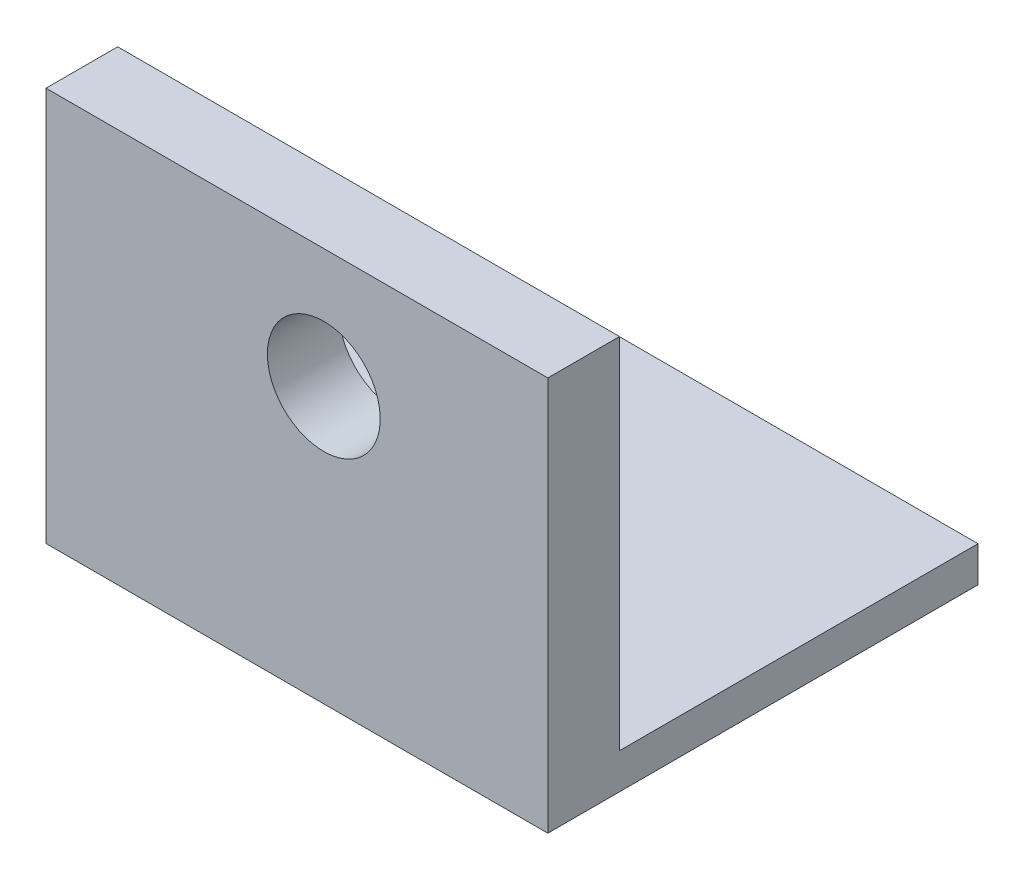
ISO-10303-21;
HEADER;
FILE_DESCRIPTION(('STEP AP214'),'2;1');
FILE_NAME('part.step','',(''),(''),'','','');
FILE_SCHEMA(('AUTOMOTIVE_DESIGN { 1 0 10303 214 1 1 1 1 }'));
ENDSEC;
DATA;
#1=APPLICATION_CONTEXT('core data for automotive mechanical design processes');
#2=APPLICATION_PROTOCOL_DEFINITION('international standard','automotive_design',2000,#1);
#3=PRODUCT_CONTEXT('',#1,'mechanical');
#4=PRODUCT('Part','Part','',(#3));
#5=PRODUCT_RELATED_PRODUCT_CATEGORY('part','',(#4));
#6=PRODUCT_DEFINITION_FORMATION('','',#4);
#7=PRODUCT_DEFINITION_CONTEXT('part definition',#1,'design');
#8=PRODUCT_DEFINITION('design','',#6,#7);
#9=PRODUCT_DEFINITION_SHAPE('','',#8);
#10=(LENGTH_UNIT() NAMED_UNIT(*) SI_UNIT(.MILLI.,.METRE.));
#11=(NAMED_UNIT(*) PLANE_ANGLE_UNIT() SI_UNIT($,.RADIAN.));
#12=(NAMED_UNIT(*) SI_UNIT($,.STERADIAN.) SOLID_ANGLE_UNIT());
#13=UNCERTAINTY_MEASURE_WITH_UNIT(LENGTH_MEASURE(1.E-05),#10,'distance_accuracy_value','');
#14=(GEOMETRIC_REPRESENTATION_CONTEXT(3) GLOBAL_UNCERTAINTY_ASSIGNED_CONTEXT((#13)) GLOBAL_UNIT_ASSIGNED_CONTEXT((#10,
#11,#12)) REPRESENTATION_CONTEXT('',''));
#15=CARTESIAN_POINT('',(0.,0.,0.));
#16=DIRECTION('',(0.,0.,1.));
#17=DIRECTION('',(1.,0.,0.));
#18=AXIS2_PLACEMENT_3D('',#15,#16,#17);
#19=CARTESIAN_POINT('',(0.,0.,120.));
#20=DIRECTION('',(1.,0.,0.));
#21=DIRECTION('',(0.,0.,-1.));
#22=AXIS2_PLACEMENT_3D('',#19,#20,#21);
#23=PLANE('',#22);
#24=DIRECTION('',(0.,0.,1.));
#25=VECTOR('',#24,1.);
#26=CARTESIAN_POINT('',(0.,9.94753881838761,-268.386381919799));
#27=LINE('',#26,#25);
#28=CARTESIAN_POINT('',(0.,9.94753881838761,0.));
#29=VERTEX_POINT('',#28);
#30=CARTESIAN_POINT('',(0.,9.94753881838761,100.));
#31=VERTEX_POINT('',#30);
#32=EDGE_CURVE('E107',#29,#31,#27,.T.);
#33=ORIENTED_EDGE('',*,*,#32,.F.);
#34=DIRECTION('',(0.,-1.,0.));
#35=VECTOR('',#34,1.);
#36=CARTESIAN_POINT('',(0.,0.,0.));
#37=LINE('',#36,#35);
#38=CARTESIAN_POINT('',(0.,0.,0.));
#39=VERTEX_POINT('',#38);
#40=EDGE_CURVE('E136',#29,#39,#37,.T.);
#41=ORIENTED_EDGE('',*,*,#40,.T.);
#42=DIRECTION('',(0.,0.,-1.));
#43=VECTOR('',#42,1.);
#44=CARTESIAN_POINT('',(0.,0.,120.));
#45=LINE('',#44,#43);
#46=CARTESIAN_POINT('',(0.,0.,120.));
#47=VERTEX_POINT('',#46);
#48=EDGE_CURVE('E11',#47,#39,#45,.T.);
#49=ORIENTED_EDGE('',*,*,#48,.F.);
#50=DIRECTION('',(0.,-1.,0.));
#51=VECTOR('',#50,1.);
#52=CARTESIAN_POINT('',(0.,0.,120.));
#53=LINE('',#52,#51);
#54=CARTESIAN_POINT('',(0.,110.,120.));
#55=VERTEX_POINT('',#54);
#56=EDGE_CURVE('E129',#55,#47,#53,.T.);
#57=ORIENTED_EDGE('',*,*,#56,.F.);
#58=DIRECTION('',(0.,0.,-1.));
#59=VECTOR('',#58,1.);
#60=CARTESIAN_POINT('',(0.,110.,120.));
#61=LINE('',#60,#59);
#62=CARTESIAN_POINT('',(0.,110.,100.));
#63=VERTEX_POINT('',#62);
#64=EDGE_CURVE('E117',#55,#63,#61,.T.);
#65=ORIENTED_EDGE('',*,*,#64,.T.);
#66=DIRECTION('',(0.,-1.,0.));
#67=VECTOR('',#66,1.);
#68=CARTESIAN_POINT('',(0.,0.,100.));
#69=LINE('',#68,#67);
#70=EDGE_CURVE('E103',#63,#31,#69,.T.);
#71=ORIENTED_EDGE('',*,*,#70,.T.);
#72=EDGE_LOOP('',(#33,#41,#49,#57,#65,#71));
#73=FACE_BOUND('',#72,.T.);
#74=ADVANCED_FACE('F41',(#73),#23,.F.);
#75=CARTESIAN_POINT('',(140.,0.,120.));
#76=DIRECTION('',(-1.,0.,0.));
#77=DIRECTION('',(0.,0.,1.));
#78=AXIS2_PLACEMENT_3D('',#75,#76,#77);
#79=PLANE('',#78);
#80=DIRECTION('',(0.,0.,1.));
#81=VECTOR('',#80,1.);
#82=CARTESIAN_POINT('',(140.,9.94753881838761,-268.386381919799));
#83=LINE('',#82,#81);
#84=CARTESIAN_POINT('',(140.,9.94753881838761,0.));
#85=VERTEX_POINT('',#84);
#86=CARTESIAN_POINT('',(140.,9.94753881838761,100.));
#87=VERTEX_POINT('',#86);
#88=EDGE_CURVE('E55',#85,#87,#83,.T.);
#89=ORIENTED_EDGE('',*,*,#88,.T.);
#90=DIRECTION('',(0.,1.,0.));
#91=VECTOR('',#90,1.);
#92=CARTESIAN_POINT('',(140.,0.,100.));
#93=LINE('',#92,#91);
#94=CARTESIAN_POINT('',(140.,110.,100.));
#95=VERTEX_POINT('',#94);
#96=EDGE_CURVE('E106',#87,#95,#93,.T.);
#97=ORIENTED_EDGE('',*,*,#96,.T.);
#98=DIRECTION('',(0.,0.,-1.));
#99=VECTOR('',#98,1.);
#100=CARTESIAN_POINT('',(140.,110.,120.));
#101=LINE('',#100,#99);
#102=CARTESIAN_POINT('',(140.,110.,120.));
#103=VERTEX_POINT('',#102);
#104=EDGE_CURVE('E142',#103,#95,#101,.T.);
#105=ORIENTED_EDGE('',*,*,#104,.F.);
#106=DIRECTION('',(0.,1.,0.));
#107=VECTOR('',#106,1.);
#108=CARTESIAN_POINT('',(140.,0.,120.));
#109=LINE('',#108,#107);
#110=CARTESIAN_POINT('',(140.,0.,120.));
#111=VERTEX_POINT('',#110);
#112=EDGE_CURVE('E133',#111,#103,#109,.T.);
#113=ORIENTED_EDGE('',*,*,#112,.F.);
#114=DIRECTION('',(0.,0.,-1.));
#115=VECTOR('',#114,1.);
#116=CARTESIAN_POINT('',(140.,0.,120.));
#117=LINE('',#116,#115);
#118=CARTESIAN_POINT('',(140.,0.,0.));
#119=VERTEX_POINT('',#118);
#120=EDGE_CURVE('E48',#111,#119,#117,.T.);
#121=ORIENTED_EDGE('',*,*,#120,.T.);
#122=DIRECTION('',(0.,1.,0.));
#123=VECTOR('',#122,1.);
#124=CARTESIAN_POINT('',(140.,0.,0.));
#125=LINE('',#124,#123);
#126=EDGE_CURVE('E131',#119,#85,#125,.T.);
#127=ORIENTED_EDGE('',*,*,#126,.T.);
#128=EDGE_LOOP('',(#89,#97,#105,#113,#121,#127));
#129=FACE_BOUND('',#128,.T.);
#130=ADVANCED_FACE('F147',(#129),#79,.F.);
#131=CARTESIAN_POINT('',(0.,110.,120.));
#132=DIRECTION('',(0.,-1.,0.));
#133=DIRECTION('',(0.,0.,-1.));
#134=AXIS2_PLACEMENT_3D('',#131,#132,#133);
#135=PLANE('',#134);
#136=DIRECTION('',(-1.,0.,0.));
#137=VECTOR('',#136,1.);
#138=CARTESIAN_POINT('',(0.,110.,100.));
#139=LINE('',#138,#137);
#140=EDGE_CURVE('E118',#95,#63,#139,.T.);
#141=ORIENTED_EDGE('',*,*,#140,.T.);
#142=ORIENTED_EDGE('',*,*,#64,.F.);
#143=DIRECTION('',(-1.,0.,0.));
#144=VECTOR('',#143,1.);
#145=CARTESIAN_POINT('',(0.,110.,120.));
#146=LINE('',#145,#144);
#147=EDGE_CURVE('E64',#103,#55,#146,.T.);
#148=ORIENTED_EDGE('',*,*,#147,.F.);
#149=ORIENTED_EDGE('',*,*,#104,.T.);
#150=EDGE_LOOP('',(#141,#142,#148,#149));
#151=FACE_BOUND('',#150,.T.);
#152=ADVANCED_FACE('F174',(#151),#135,.F.);
#153=CARTESIAN_POINT('',(0.,0.,0.));
#154=DIRECTION('',(0.,0.,-1.));
#155=DIRECTION('',(-1.,0.,0.));
#156=AXIS2_PLACEMENT_3D('',#153,#154,#155);
#157=PLANE('',#156);
#158=ORIENTED_EDGE('',*,*,#40,.F.);
#159=DIRECTION('',(-1.,0.,0.));
#160=VECTOR('',#159,1.);
#161=CARTESIAN_POINT('',(140.,9.94753881838761,0.));
#162=LINE('',#161,#160);
#163=EDGE_CURVE('E111',#85,#29,#162,.T.);
#164=ORIENTED_EDGE('',*,*,#163,.F.);
#165=ORIENTED_EDGE('',*,*,#126,.F.);
#166=DIRECTION('',(1.,0.,0.));
#167=VECTOR('',#166,1.);
#168=CARTESIAN_POINT('',(0.,0.,0.));
#169=LINE('',#168,#167);
#170=EDGE_CURVE('E79',#39,#119,#169,.T.);
#171=ORIENTED_EDGE('',*,*,#170,.F.);
#172=EDGE_LOOP('',(#158,#164,#165,#171));
#173=FACE_BOUND('',#172,.T.);
#174=ADVANCED_FACE('F150',(#173),#157,.T.);
#175=CARTESIAN_POINT('',(0.,0.,120.));
#176=DIRECTION('',(0.,1.,0.));
#177=DIRECTION('',(0.,0.,1.));
#178=AXIS2_PLACEMENT_3D('',#175,#176,#177);
#179=PLANE('',#178);
#180=ORIENTED_EDGE('',*,*,#170,.T.);
#181=ORIENTED_EDGE('',*,*,#120,.F.);
#182=DIRECTION('',(1.,0.,0.));
#183=VECTOR('',#182,1.);
#184=CARTESIAN_POINT('',(0.,0.,120.));
#185=LINE('',#184,#183);
#186=EDGE_CURVE('E84',#47,#111,#185,.T.);
#187=ORIENTED_EDGE('',*,*,#186,.F.);
#188=ORIENTED_EDGE('',*,*,#48,.T.);
#189=EDGE_LOOP('',(#180,#181,#187,#188));
#190=FACE_BOUND('',#189,.T.);
#191=ADVANCED_FACE('F182',(#190),#179,.F.);
#192=CARTESIAN_POINT('',(0.,0.,120.));
#193=DIRECTION('',(0.,0.,-1.));
#194=DIRECTION('',(-1.,0.,0.));
#195=AXIS2_PLACEMENT_3D('',#192,#193,#194);
#196=PLANE('',#195);
#197=CARTESIAN_POINT('',(77.4977805249506,76.7015635679229,120.));
#198=DIRECTION('',(0.,0.,-1.));
#199=DIRECTION('',(-1.,0.,0.));
#200=AXIS2_PLACEMENT_3D('',#197,#198,#199);
#201=CIRCLE('',#200,15.7394009134876);
#202=CARTESIAN_POINT('',(61.758379611463,76.7015635679229,120.));
#203=VERTEX_POINT('',#202);
#204=EDGE_CURVE('E119',#203,#203,#201,.T.);
#205=ORIENTED_EDGE('',*,*,#204,.T.);
#206=EDGE_LOOP('',(#205));
#207=FACE_BOUND('',#206,.T.);
#208=ORIENTED_EDGE('',*,*,#56,.T.);
#209=ORIENTED_EDGE('',*,*,#186,.T.);
#210=ORIENTED_EDGE('',*,*,#112,.T.);
#211=ORIENTED_EDGE('',*,*,#147,.T.);
#212=EDGE_LOOP('',(#208,#209,#210,#211));
#213=FACE_BOUND('',#212,.T.);
#214=ADVANCED_FACE('F167',(#207,#213),#196,.F.);
#215=CARTESIAN_POINT('',(140.,9.94753881838761,-268.386381919799));
#216=DIRECTION('',(0.,1.,0.));
#217=DIRECTION('',(0.,0.,1.));
#218=AXIS2_PLACEMENT_3D('',#215,#216,#217);
#219=PLANE('',#218);
#220=ORIENTED_EDGE('',*,*,#88,.F.);
#221=ORIENTED_EDGE('',*,*,#163,.T.);
#222=ORIENTED_EDGE('',*,*,#32,.T.);
#223=DIRECTION('',(-1.,0.,0.));
#224=VECTOR('',#223,1.);
#225=CARTESIAN_POINT('',(140.,9.94753881838761,100.));
#226=LINE('',#225,#224);
#227=EDGE_CURVE('E99',#87,#31,#226,.T.);
#228=ORIENTED_EDGE('',*,*,#227,.F.);
#229=EDGE_LOOP('',(#220,#221,#222,#228));
#230=FACE_BOUND('',#229,.T.);
#231=ADVANCED_FACE('F110',(#230),#219,.T.);
#232=CARTESIAN_POINT('',(0.,0.,100.));
#233=DIRECTION('',(0.,0.,-1.));
#234=DIRECTION('',(-1.,0.,0.));
#235=AXIS2_PLACEMENT_3D('',#232,#233,#234);
#236=PLANE('',#235);
#237=CARTESIAN_POINT('',(77.4977805249506,76.7015635679229,100.));
#238=DIRECTION('',(0.,0.,-1.));
#239=DIRECTION('',(-1.,0.,0.));
#240=AXIS2_PLACEMENT_3D('',#237,#238,#239);
#241=CIRCLE('',#240,15.7394009134876);
#242=CARTESIAN_POINT('',(61.758379611463,76.7015635679229,100.));
#243=VERTEX_POINT('',#242);
#244=EDGE_CURVE('E123',#243,#243,#241,.T.);
#245=ORIENTED_EDGE('',*,*,#244,.F.);
#246=EDGE_LOOP('',(#245));
#247=FACE_BOUND('',#246,.T.);
#248=ORIENTED_EDGE('',*,*,#227,.T.);
#249=ORIENTED_EDGE('',*,*,#70,.F.);
#250=ORIENTED_EDGE('',*,*,#140,.F.);
#251=ORIENTED_EDGE('',*,*,#96,.F.);
#252=EDGE_LOOP('',(#248,#249,#250,#251));
#253=FACE_BOUND('',#252,.T.);
#254=ADVANCED_FACE('F101',(#247,#253),#236,.T.);
#255=CARTESIAN_POINT('',(77.4977805249506,76.7015635679229,120.));
#256=DIRECTION('',(0.,0.,-1.));
#257=DIRECTION('',(-1.,0.,0.));
#258=AXIS2_PLACEMENT_3D('',#255,#256,#257);
#259=CYLINDRICAL_SURFACE('',#258,15.7394009134876);
#260=ORIENTED_EDGE('',*,*,#204,.F.);
#261=EDGE_LOOP('',(#260));
#262=FACE_BOUND('',#261,.T.);
#263=ORIENTED_EDGE('',*,*,#244,.T.);
#264=EDGE_LOOP('',(#263));
#265=FACE_BOUND('',#264,.T.);
#266=ADVANCED_FACE('F155',(#262,#265),#259,.F.);
#267=CLOSED_SHELL('',(#74,#130,#152,#174,#191,#214,#231,#254,#266));
#268=MANIFOLD_SOLID_BREP('B2',#267);
#269=ADVANCED_BREP_SHAPE_REPRESENTATION('',(#18,#268),#14);
#270=SHAPE_DEFINITION_REPRESENTATION(#9,#269);
ENDSEC;
END-ISO-10303-21;
